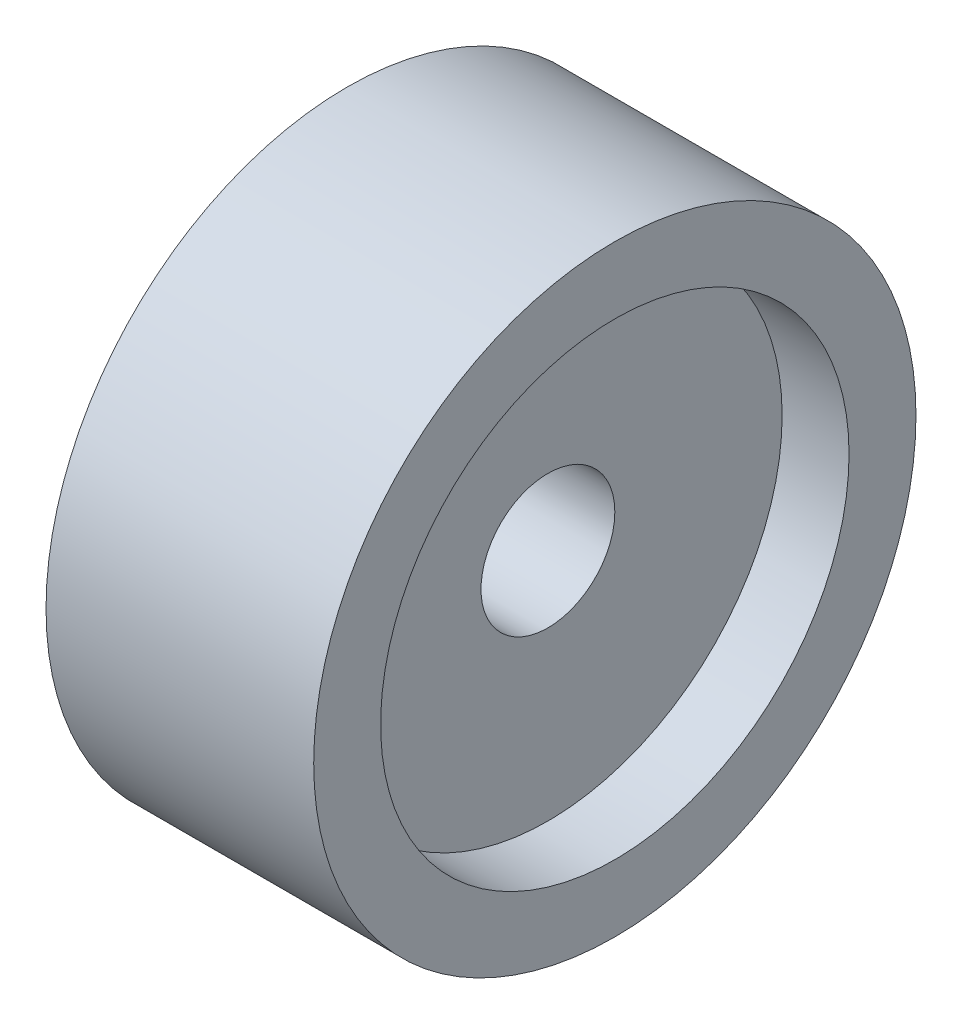
ISO-10303-21;
HEADER;
FILE_DESCRIPTION(('STEP AP214'),'2;1');
FILE_NAME('part.step','',(''),(''),'','','');
FILE_SCHEMA(('AUTOMOTIVE_DESIGN { 1 0 10303 214 1 1 1 1 }'));
ENDSEC;
DATA;
#1=APPLICATION_CONTEXT('core data for automotive mechanical design processes');
#2=APPLICATION_PROTOCOL_DEFINITION('international standard','automotive_design',2000,#1);
#3=PRODUCT_CONTEXT('',#1,'mechanical');
#4=PRODUCT('Part','Part','',(#3));
#5=PRODUCT_RELATED_PRODUCT_CATEGORY('part','',(#4));
#6=PRODUCT_DEFINITION_FORMATION('','',#4);
#7=PRODUCT_DEFINITION_CONTEXT('part definition',#1,'design');
#8=PRODUCT_DEFINITION('design','',#6,#7);
#9=PRODUCT_DEFINITION_SHAPE('','',#8);
#10=(LENGTH_UNIT() NAMED_UNIT(*) SI_UNIT(.MILLI.,.METRE.));
#11=(NAMED_UNIT(*) PLANE_ANGLE_UNIT() SI_UNIT($,.RADIAN.));
#12=(NAMED_UNIT(*) SI_UNIT($,.STERADIAN.) SOLID_ANGLE_UNIT());
#13=UNCERTAINTY_MEASURE_WITH_UNIT(LENGTH_MEASURE(1.E-05),#10,'distance_accuracy_value','');
#14=(GEOMETRIC_REPRESENTATION_CONTEXT(3) GLOBAL_UNCERTAINTY_ASSIGNED_CONTEXT((#13)) GLOBAL_UNIT_ASSIGNED_CONTEXT((#10,
#11,#12)) REPRESENTATION_CONTEXT('',''));
#15=CARTESIAN_POINT('',(0.,0.,0.));
#16=DIRECTION('',(0.,0.,1.));
#17=DIRECTION('',(1.,0.,0.));
#18=AXIS2_PLACEMENT_3D('',#15,#16,#17);
#19=CARTESIAN_POINT('',(100.,0.,0.));
#20=DIRECTION('',(1.,0.,0.));
#21=DIRECTION('',(0.,0.,-1.));
#22=AXIS2_PLACEMENT_3D('',#19,#20,#21);
#23=PLANE('',#22);
#24=CARTESIAN_POINT('',(100.,0.,0.));
#25=DIRECTION('',(1.,0.,0.));
#26=DIRECTION('',(0.,0.,-1.));
#27=AXIS2_PLACEMENT_3D('',#24,#25,#26);
#28=CIRCLE('',#27,50.);
#29=CARTESIAN_POINT('',(100.,0.,-50.));
#30=VERTEX_POINT('',#29);
#31=EDGE_CURVE('E38',#30,#30,#28,.T.);
#32=ORIENTED_EDGE('',*,*,#31,.F.);
#33=EDGE_LOOP('',(#32));
#34=FACE_BOUND('',#33,.T.);
#35=CARTESIAN_POINT('',(100.,0.,0.));
#36=DIRECTION('',(1.,0.,0.));
#37=DIRECTION('',(0.,0.,-1.));
#38=AXIS2_PLACEMENT_3D('',#35,#36,#37);
#39=CIRCLE('',#38,175.);
#40=CARTESIAN_POINT('',(100.,0.,-175.));
#41=VERTEX_POINT('',#40);
#42=EDGE_CURVE('E47',#41,#41,#39,.T.);
#43=ORIENTED_EDGE('',*,*,#42,.T.);
#44=EDGE_LOOP('',(#43));
#45=FACE_BOUND('',#44,.T.);
#46=ADVANCED_FACE('F31',(#34,#45),#23,.T.);
#47=CARTESIAN_POINT('',(0.,0.,0.));
#48=DIRECTION('',(1.,0.,0.));
#49=DIRECTION('',(0.,0.,-1.));
#50=AXIS2_PLACEMENT_3D('',#47,#48,#49);
#51=PLANE('',#50);
#52=CARTESIAN_POINT('',(0.,0.,0.));
#53=DIRECTION('',(1.,0.,0.));
#54=DIRECTION('',(0.,0.,-1.));
#55=AXIS2_PLACEMENT_3D('',#52,#53,#54);
#56=CIRCLE('',#55,50.);
#57=CARTESIAN_POINT('',(0.,0.,-50.));
#58=VERTEX_POINT('',#57);
#59=EDGE_CURVE('E42',#58,#58,#56,.T.);
#60=ORIENTED_EDGE('',*,*,#59,.T.);
#61=EDGE_LOOP('',(#60));
#62=FACE_BOUND('',#61,.T.);
#63=CARTESIAN_POINT('',(0.,0.,0.));
#64=DIRECTION('',(1.,0.,0.));
#65=DIRECTION('',(0.,0.,-1.));
#66=AXIS2_PLACEMENT_3D('',#63,#64,#65);
#67=CIRCLE('',#66,175.);
#68=CARTESIAN_POINT('',(0.,0.,-175.));
#69=VERTEX_POINT('',#68);
#70=EDGE_CURVE('E10',#69,#69,#67,.T.);
#71=ORIENTED_EDGE('',*,*,#70,.F.);
#72=EDGE_LOOP('',(#71));
#73=FACE_BOUND('',#72,.T.);
#74=ADVANCED_FACE('F33',(#62,#73),#51,.F.);
#75=CARTESIAN_POINT('',(100.,0.,0.));
#76=DIRECTION('',(-1.,0.,0.));
#77=DIRECTION('',(0.,0.,1.));
#78=AXIS2_PLACEMENT_3D('',#75,#76,#77);
#79=CYLINDRICAL_SURFACE('',#78,50.);
#80=ORIENTED_EDGE('',*,*,#31,.T.);
#81=EDGE_LOOP('',(#80));
#82=FACE_BOUND('',#81,.T.);
#83=ORIENTED_EDGE('',*,*,#59,.F.);
#84=EDGE_LOOP('',(#83));
#85=FACE_BOUND('',#84,.T.);
#86=ADVANCED_FACE('F83',(#82,#85),#79,.F.);
#87=CARTESIAN_POINT('',(-50.,0.,0.));
#88=DIRECTION('',(1.,0.,0.));
#89=DIRECTION('',(0.,0.,-1.));
#90=AXIS2_PLACEMENT_3D('',#87,#88,#89);
#91=CYLINDRICAL_SURFACE('',#90,175.);
#92=CARTESIAN_POINT('',(-50.,0.,0.));
#93=DIRECTION('',(1.,0.,0.));
#94=DIRECTION('',(0.,0.,-1.));
#95=AXIS2_PLACEMENT_3D('',#92,#93,#94);
#96=CIRCLE('',#95,175.);
#97=CARTESIAN_POINT('',(-50.,0.,-175.));
#98=VERTEX_POINT('',#97);
#99=EDGE_CURVE('E54',#98,#98,#96,.T.);
#100=ORIENTED_EDGE('',*,*,#99,.F.);
#101=EDGE_LOOP('',(#100));
#102=FACE_BOUND('',#101,.T.);
#103=ORIENTED_EDGE('',*,*,#70,.T.);
#104=EDGE_LOOP('',(#103));
#105=FACE_BOUND('',#104,.T.);
#106=ADVANCED_FACE('F76',(#102,#105),#91,.F.);
#107=CARTESIAN_POINT('',(-50.,0.,0.));
#108=DIRECTION('',(1.,0.,0.));
#109=DIRECTION('',(0.,0.,-1.));
#110=AXIS2_PLACEMENT_3D('',#107,#108,#109);
#111=CYLINDRICAL_SURFACE('',#110,225.);
#112=CARTESIAN_POINT('',(-50.,0.,0.));
#113=DIRECTION('',(1.,0.,0.));
#114=DIRECTION('',(0.,0.,-1.));
#115=AXIS2_PLACEMENT_3D('',#112,#113,#114);
#116=CIRCLE('',#115,225.);
#117=CARTESIAN_POINT('',(-50.,0.,-225.));
#118=VERTEX_POINT('',#117);
#119=EDGE_CURVE('E51',#118,#118,#116,.T.);
#120=ORIENTED_EDGE('',*,*,#119,.T.);
#121=EDGE_LOOP('',(#120));
#122=FACE_BOUND('',#121,.T.);
#123=CARTESIAN_POINT('',(150.,0.,0.));
#124=DIRECTION('',(1.,0.,0.));
#125=DIRECTION('',(0.,0.,-1.));
#126=AXIS2_PLACEMENT_3D('',#123,#124,#125);
#127=CIRCLE('',#126,225.);
#128=CARTESIAN_POINT('',(150.,0.,-225.));
#129=VERTEX_POINT('',#128);
#130=EDGE_CURVE('E57',#129,#129,#127,.T.);
#131=ORIENTED_EDGE('',*,*,#130,.F.);
#132=EDGE_LOOP('',(#131));
#133=FACE_BOUND('',#132,.T.);
#134=ADVANCED_FACE('F89',(#122,#133),#111,.T.);
#135=CARTESIAN_POINT('',(-50.,0.,0.));
#136=DIRECTION('',(1.,0.,0.));
#137=DIRECTION('',(0.,0.,-1.));
#138=AXIS2_PLACEMENT_3D('',#135,#136,#137);
#139=PLANE('',#138);
#140=ORIENTED_EDGE('',*,*,#99,.T.);
#141=EDGE_LOOP('',(#140));
#142=FACE_BOUND('',#141,.T.);
#143=ORIENTED_EDGE('',*,*,#119,.F.);
#144=EDGE_LOOP('',(#143));
#145=FACE_BOUND('',#144,.T.);
#146=ADVANCED_FACE('F73',(#142,#145),#139,.F.);
#147=ORIENTED_EDGE('',*,*,#42,.F.);
#148=EDGE_LOOP('',(#147));
#149=FACE_BOUND('',#148,.T.);
#150=CARTESIAN_POINT('',(150.,0.,0.));
#151=DIRECTION('',(1.,0.,0.));
#152=DIRECTION('',(0.,0.,-1.));
#153=AXIS2_PLACEMENT_3D('',#150,#151,#152);
#154=CIRCLE('',#153,175.);
#155=CARTESIAN_POINT('',(150.,0.,-175.));
#156=VERTEX_POINT('',#155);
#157=EDGE_CURVE('E60',#156,#156,#154,.T.);
#158=ORIENTED_EDGE('',*,*,#157,.T.);
#159=EDGE_LOOP('',(#158));
#160=FACE_BOUND('',#159,.T.);
#161=ADVANCED_FACE('F64',(#149,#160),#91,.F.);
#162=CARTESIAN_POINT('',(150.,0.,0.));
#163=DIRECTION('',(1.,0.,0.));
#164=DIRECTION('',(0.,0.,-1.));
#165=AXIS2_PLACEMENT_3D('',#162,#163,#164);
#166=PLANE('',#165);
#167=ORIENTED_EDGE('',*,*,#130,.T.);
#168=EDGE_LOOP('',(#167));
#169=FACE_BOUND('',#168,.T.);
#170=ORIENTED_EDGE('',*,*,#157,.F.);
#171=EDGE_LOOP('',(#170));
#172=FACE_BOUND('',#171,.T.);
#173=ADVANCED_FACE('F66',(#169,#172),#166,.T.);
#174=CLOSED_SHELL('',(#46,#74,#86,#106,#134,#146,#161,#173));
#175=MANIFOLD_SOLID_BREP('B2',#174);
#176=ADVANCED_BREP_SHAPE_REPRESENTATION('',(#18,#175),#14);
#177=SHAPE_DEFINITION_REPRESENTATION(#9,#176);
ENDSEC;
END-ISO-10303-21;
